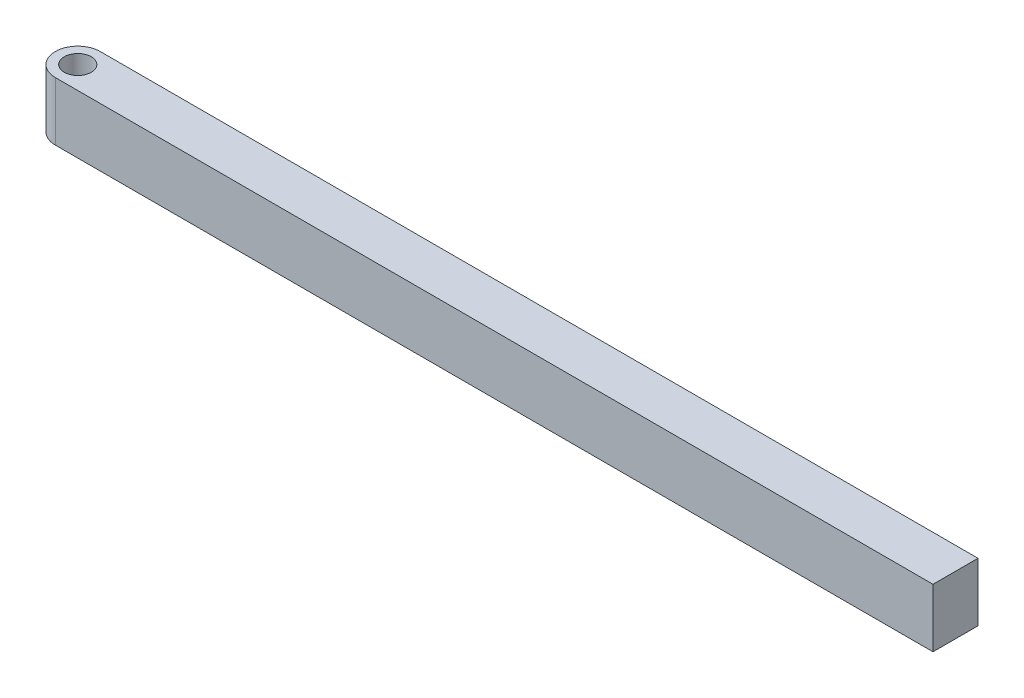
ISO-10303-21;
HEADER;
FILE_DESCRIPTION(('STEP AP214'),'2;1');
FILE_NAME('part.step','',(''),(''),'','','');
FILE_SCHEMA(('AUTOMOTIVE_DESIGN { 1 0 10303 214 1 1 1 1 }'));
ENDSEC;
DATA;
#1=APPLICATION_CONTEXT('core data for automotive mechanical design processes');
#2=APPLICATION_PROTOCOL_DEFINITION('international standard','automotive_design',2000,#1);
#3=PRODUCT_CONTEXT('',#1,'mechanical');
#4=PRODUCT('Part','Part','',(#3));
#5=PRODUCT_RELATED_PRODUCT_CATEGORY('part','',(#4));
#6=PRODUCT_DEFINITION_FORMATION('','',#4);
#7=PRODUCT_DEFINITION_CONTEXT('part definition',#1,'design');
#8=PRODUCT_DEFINITION('design','',#6,#7);
#9=PRODUCT_DEFINITION_SHAPE('','',#8);
#10=(LENGTH_UNIT() NAMED_UNIT(*) SI_UNIT(.MILLI.,.METRE.));
#11=(NAMED_UNIT(*) PLANE_ANGLE_UNIT() SI_UNIT($,.RADIAN.));
#12=(NAMED_UNIT(*) SI_UNIT($,.STERADIAN.) SOLID_ANGLE_UNIT());
#13=UNCERTAINTY_MEASURE_WITH_UNIT(LENGTH_MEASURE(1.E-05),#10,'distance_accuracy_value','');
#14=(GEOMETRIC_REPRESENTATION_CONTEXT(3) GLOBAL_UNCERTAINTY_ASSIGNED_CONTEXT((#13)) GLOBAL_UNIT_ASSIGNED_CONTEXT((#10,
#11,#12)) REPRESENTATION_CONTEXT('',''));
#15=CARTESIAN_POINT('',(0.,0.,0.));
#16=DIRECTION('',(0.,0.,1.));
#17=DIRECTION('',(1.,0.,0.));
#18=AXIS2_PLACEMENT_3D('',#15,#16,#17);
#19=CARTESIAN_POINT('',(200.,6.5,-5.));
#20=DIRECTION('',(0.,-1.,0.));
#21=DIRECTION('',(0.,0.,-1.));
#22=AXIS2_PLACEMENT_3D('',#19,#20,#21);
#23=PLANE('',#22);
#24=CARTESIAN_POINT('',(5.,6.5,0.));
#25=DIRECTION('',(0.,1.,0.));
#26=DIRECTION('',(0.,0.,1.));
#27=AXIS2_PLACEMENT_3D('',#24,#25,#26);
#28=CIRCLE('',#27,3.);
#29=CARTESIAN_POINT('',(5.,6.5,3.));
#30=VERTEX_POINT('',#29);
#31=EDGE_CURVE('E128',#30,#30,#28,.T.);
#32=ORIENTED_EDGE('',*,*,#31,.F.);
#33=EDGE_LOOP('',(#32));
#34=FACE_BOUND('',#33,.T.);
#35=CARTESIAN_POINT('',(5.,6.5,0.));
#36=DIRECTION('',(0.,-1.,0.));
#37=DIRECTION('',(0.,0.,-1.));
#38=AXIS2_PLACEMENT_3D('',#35,#36,#37);
#39=CIRCLE('',#38,5.);
#40=CARTESIAN_POINT('',(5.,6.5,-5.));
#41=VERTEX_POINT('',#40);
#42=CARTESIAN_POINT('',(0.,6.5,0.));
#43=VERTEX_POINT('',#42);
#44=EDGE_CURVE('E60',#41,#43,#39,.F.);
#45=ORIENTED_EDGE('',*,*,#44,.T.);
#46=CARTESIAN_POINT('',(5.,6.5,0.));
#47=DIRECTION('',(0.,-1.,0.));
#48=DIRECTION('',(0.,0.,-1.));
#49=AXIS2_PLACEMENT_3D('',#46,#47,#48);
#50=CIRCLE('',#49,5.);
#51=CARTESIAN_POINT('',(5.,6.5,5.));
#52=VERTEX_POINT('',#51);
#53=EDGE_CURVE('E48',#43,#52,#50,.F.);
#54=ORIENTED_EDGE('',*,*,#53,.T.);
#55=DIRECTION('',(-1.,0.,0.));
#56=VECTOR('',#55,1.);
#57=CARTESIAN_POINT('',(200.,6.5,5.));
#58=LINE('',#57,#56);
#59=CARTESIAN_POINT('',(200.,6.5,5.));
#60=VERTEX_POINT('',#59);
#61=EDGE_CURVE('E92',#60,#52,#58,.T.);
#62=ORIENTED_EDGE('',*,*,#61,.F.);
#63=DIRECTION('',(0.,0.,1.));
#64=VECTOR('',#63,1.);
#65=CARTESIAN_POINT('',(200.,6.5,-5.));
#66=LINE('',#65,#64);
#67=CARTESIAN_POINT('',(200.,6.5,-5.));
#68=VERTEX_POINT('',#67);
#69=EDGE_CURVE('E99',#68,#60,#66,.T.);
#70=ORIENTED_EDGE('',*,*,#69,.F.);
#71=DIRECTION('',(-1.,0.,0.));
#72=VECTOR('',#71,1.);
#73=CARTESIAN_POINT('',(200.,6.5,-5.));
#74=LINE('',#73,#72);
#75=EDGE_CURVE('E138',#68,#41,#74,.T.);
#76=ORIENTED_EDGE('',*,*,#75,.T.);
#77=EDGE_LOOP('',(#45,#54,#62,#70,#76));
#78=FACE_BOUND('',#77,.T.);
#79=ADVANCED_FACE('F39',(#34,#78),#23,.F.);
#80=CARTESIAN_POINT('',(200.,-6.5,5.));
#81=DIRECTION('',(0.,0.,-1.));
#82=DIRECTION('',(0.,1.,0.));
#83=AXIS2_PLACEMENT_3D('',#80,#81,#82);
#84=PLANE('',#83);
#85=ORIENTED_EDGE('',*,*,#61,.T.);
#86=DIRECTION('',(0.,-1.,0.));
#87=VECTOR('',#86,1.);
#88=CARTESIAN_POINT('',(5.,-6.5,5.));
#89=LINE('',#88,#87);
#90=CARTESIAN_POINT('',(5.,-6.5,5.));
#91=VERTEX_POINT('',#90);
#92=EDGE_CURVE('E108',#52,#91,#89,.T.);
#93=ORIENTED_EDGE('',*,*,#92,.T.);
#94=DIRECTION('',(-1.,0.,0.));
#95=VECTOR('',#94,1.);
#96=CARTESIAN_POINT('',(200.,-6.5,5.));
#97=LINE('',#96,#95);
#98=CARTESIAN_POINT('',(200.,-6.5,5.));
#99=VERTEX_POINT('',#98);
#100=EDGE_CURVE('E95',#99,#91,#97,.T.);
#101=ORIENTED_EDGE('',*,*,#100,.F.);
#102=DIRECTION('',(0.,-1.,0.));
#103=VECTOR('',#102,1.);
#104=CARTESIAN_POINT('',(200.,-6.5,5.));
#105=LINE('',#104,#103);
#106=EDGE_CURVE('E87',#60,#99,#105,.T.);
#107=ORIENTED_EDGE('',*,*,#106,.F.);
#108=EDGE_LOOP('',(#85,#93,#101,#107));
#109=FACE_BOUND('',#108,.T.);
#110=ADVANCED_FACE('F89',(#109),#84,.F.);
#111=CARTESIAN_POINT('',(200.,-6.5,-5.));
#112=DIRECTION('',(0.,1.,0.));
#113=DIRECTION('',(0.,0.,1.));
#114=AXIS2_PLACEMENT_3D('',#111,#112,#113);
#115=PLANE('',#114);
#116=CARTESIAN_POINT('',(5.,-6.5,0.));
#117=DIRECTION('',(0.,1.,0.));
#118=DIRECTION('',(0.,0.,1.));
#119=AXIS2_PLACEMENT_3D('',#116,#117,#118);
#120=CIRCLE('',#119,3.);
#121=CARTESIAN_POINT('',(5.,-6.5,3.));
#122=VERTEX_POINT('',#121);
#123=EDGE_CURVE('E105',#122,#122,#120,.T.);
#124=ORIENTED_EDGE('',*,*,#123,.T.);
#125=EDGE_LOOP('',(#124));
#126=FACE_BOUND('',#125,.T.);
#127=ORIENTED_EDGE('',*,*,#100,.T.);
#128=CARTESIAN_POINT('',(5.,-6.5,0.));
#129=DIRECTION('',(0.,1.,0.));
#130=DIRECTION('',(0.,0.,1.));
#131=AXIS2_PLACEMENT_3D('',#128,#129,#130);
#132=CIRCLE('',#131,5.);
#133=CARTESIAN_POINT('',(0.,-6.5,0.));
#134=VERTEX_POINT('',#133);
#135=EDGE_CURVE('E117',#91,#134,#132,.F.);
#136=ORIENTED_EDGE('',*,*,#135,.T.);
#137=CARTESIAN_POINT('',(5.,-6.5,0.));
#138=DIRECTION('',(0.,1.,0.));
#139=DIRECTION('',(0.,0.,1.));
#140=AXIS2_PLACEMENT_3D('',#137,#138,#139);
#141=CIRCLE('',#140,5.);
#142=CARTESIAN_POINT('',(5.,-6.5,-5.));
#143=VERTEX_POINT('',#142);
#144=EDGE_CURVE('E110',#134,#143,#141,.F.);
#145=ORIENTED_EDGE('',*,*,#144,.T.);
#146=DIRECTION('',(-1.,0.,0.));
#147=VECTOR('',#146,1.);
#148=CARTESIAN_POINT('',(200.,-6.5,-5.));
#149=LINE('',#148,#147);
#150=CARTESIAN_POINT('',(200.,-6.5,-5.));
#151=VERTEX_POINT('',#150);
#152=EDGE_CURVE('E112',#151,#143,#149,.T.);
#153=ORIENTED_EDGE('',*,*,#152,.F.);
#154=DIRECTION('',(0.,0.,-1.));
#155=VECTOR('',#154,1.);
#156=CARTESIAN_POINT('',(200.,-6.5,-5.));
#157=LINE('',#156,#155);
#158=EDGE_CURVE('E98',#99,#151,#157,.T.);
#159=ORIENTED_EDGE('',*,*,#158,.F.);
#160=EDGE_LOOP('',(#127,#136,#145,#153,#159));
#161=FACE_BOUND('',#160,.T.);
#162=ADVANCED_FACE('F122',(#126,#161),#115,.F.);
#163=CARTESIAN_POINT('',(200.,-6.5,-5.));
#164=DIRECTION('',(0.,0.,1.));
#165=DIRECTION('',(0.,-1.,0.));
#166=AXIS2_PLACEMENT_3D('',#163,#164,#165);
#167=PLANE('',#166);
#168=ORIENTED_EDGE('',*,*,#152,.T.);
#169=DIRECTION('',(0.,1.,0.));
#170=VECTOR('',#169,1.);
#171=CARTESIAN_POINT('',(5.,6.5,-5.));
#172=LINE('',#171,#170);
#173=EDGE_CURVE('E11',#143,#41,#172,.T.);
#174=ORIENTED_EDGE('',*,*,#173,.T.);
#175=ORIENTED_EDGE('',*,*,#75,.F.);
#176=DIRECTION('',(0.,1.,0.));
#177=VECTOR('',#176,1.);
#178=CARTESIAN_POINT('',(200.,-6.5,-5.));
#179=LINE('',#178,#177);
#180=EDGE_CURVE('E104',#151,#68,#179,.T.);
#181=ORIENTED_EDGE('',*,*,#180,.F.);
#182=EDGE_LOOP('',(#168,#174,#175,#181));
#183=FACE_BOUND('',#182,.T.);
#184=ADVANCED_FACE('F139',(#183),#167,.F.);
#185=CARTESIAN_POINT('',(200.,0.,0.));
#186=DIRECTION('',(-1.,0.,0.));
#187=DIRECTION('',(0.,0.,1.));
#188=AXIS2_PLACEMENT_3D('',#185,#186,#187);
#189=PLANE('',#188);
#190=ORIENTED_EDGE('',*,*,#69,.T.);
#191=ORIENTED_EDGE('',*,*,#106,.T.);
#192=ORIENTED_EDGE('',*,*,#158,.T.);
#193=ORIENTED_EDGE('',*,*,#180,.T.);
#194=EDGE_LOOP('',(#190,#191,#192,#193));
#195=FACE_BOUND('',#194,.T.);
#196=ADVANCED_FACE('F102',(#195),#189,.F.);
#197=CARTESIAN_POINT('',(5.,-6.5,0.));
#198=DIRECTION('',(0.,1.,0.));
#199=DIRECTION('',(0.,0.,1.));
#200=AXIS2_PLACEMENT_3D('',#197,#198,#199);
#201=CYLINDRICAL_SURFACE('',#200,3.);
#202=ORIENTED_EDGE('',*,*,#123,.F.);
#203=EDGE_LOOP('',(#202));
#204=FACE_BOUND('',#203,.T.);
#205=ORIENTED_EDGE('',*,*,#31,.T.);
#206=EDGE_LOOP('',(#205));
#207=FACE_BOUND('',#206,.T.);
#208=ADVANCED_FACE('F147',(#204,#207),#201,.F.);
#209=CARTESIAN_POINT('',(5.,-6.5,0.));
#210=DIRECTION('',(0.,-1.,0.));
#211=DIRECTION('',(0.,0.,-1.));
#212=AXIS2_PLACEMENT_3D('',#209,#210,#211);
#213=CYLINDRICAL_SURFACE('',#212,5.);
#214=DIRECTION('',(0.,1.,0.));
#215=VECTOR('',#214,1.);
#216=CARTESIAN_POINT('',(0.,-6.5,0.));
#217=LINE('',#216,#215);
#218=EDGE_CURVE('E43',#43,#134,#217,.F.);
#219=ORIENTED_EDGE('',*,*,#218,.F.);
#220=ORIENTED_EDGE('',*,*,#44,.F.);
#221=ORIENTED_EDGE('',*,*,#173,.F.);
#222=ORIENTED_EDGE('',*,*,#144,.F.);
#223=EDGE_LOOP('',(#219,#220,#221,#222));
#224=FACE_BOUND('',#223,.T.);
#225=ADVANCED_FACE('F41',(#224),#213,.T.);
#226=CARTESIAN_POINT('',(5.,-6.5,0.));
#227=DIRECTION('',(0.,1.,0.));
#228=DIRECTION('',(0.,0.,1.));
#229=AXIS2_PLACEMENT_3D('',#226,#227,#228);
#230=CYLINDRICAL_SURFACE('',#229,5.);
#231=ORIENTED_EDGE('',*,*,#53,.F.);
#232=ORIENTED_EDGE('',*,*,#218,.T.);
#233=ORIENTED_EDGE('',*,*,#135,.F.);
#234=ORIENTED_EDGE('',*,*,#92,.F.);
#235=EDGE_LOOP('',(#231,#232,#233,#234));
#236=FACE_BOUND('',#235,.T.);
#237=ADVANCED_FACE('F127',(#236),#230,.T.);
#238=CLOSED_SHELL('',(#79,#110,#162,#184,#196,#208,#225,#237));
#239=MANIFOLD_SOLID_BREP('B2',#238);
#240=ADVANCED_BREP_SHAPE_REPRESENTATION('',(#18,#239),#14);
#241=SHAPE_DEFINITION_REPRESENTATION(#9,#240);
ENDSEC;
END-ISO-10303-21;
